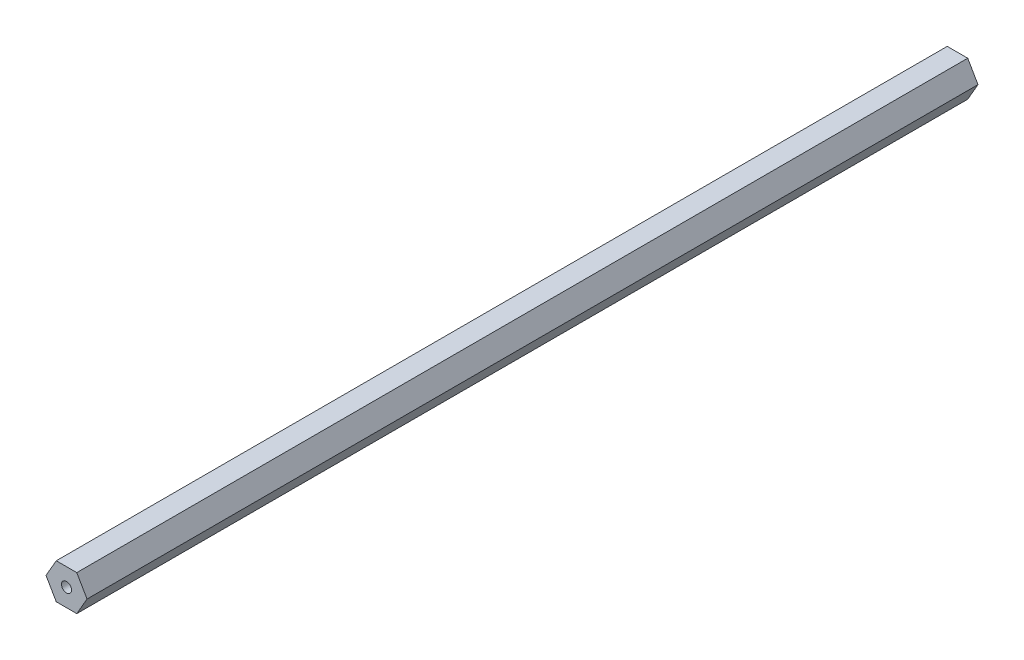
ISO-10303-21;
HEADER;
FILE_DESCRIPTION(('STEP AP214'),'2;1');
FILE_NAME('part.step','',(''),(''),'','','');
FILE_SCHEMA(('AUTOMOTIVE_DESIGN { 1 0 10303 214 1 1 1 1 }'));
ENDSEC;
DATA;
#1=APPLICATION_CONTEXT('core data for automotive mechanical design processes');
#2=APPLICATION_PROTOCOL_DEFINITION('international standard','automotive_design',2000,#1);
#3=PRODUCT_CONTEXT('',#1,'mechanical');
#4=PRODUCT('Part','Part','',(#3));
#5=PRODUCT_RELATED_PRODUCT_CATEGORY('part','',(#4));
#6=PRODUCT_DEFINITION_FORMATION('','',#4);
#7=PRODUCT_DEFINITION_CONTEXT('part definition',#1,'design');
#8=PRODUCT_DEFINITION('design','',#6,#7);
#9=PRODUCT_DEFINITION_SHAPE('','',#8);
#10=(LENGTH_UNIT() NAMED_UNIT(*) SI_UNIT(.MILLI.,.METRE.));
#11=(NAMED_UNIT(*) PLANE_ANGLE_UNIT() SI_UNIT($,.RADIAN.));
#12=(NAMED_UNIT(*) SI_UNIT($,.STERADIAN.) SOLID_ANGLE_UNIT());
#13=UNCERTAINTY_MEASURE_WITH_UNIT(LENGTH_MEASURE(1.E-05),#10,'distance_accuracy_value','');
#14=(GEOMETRIC_REPRESENTATION_CONTEXT(3) GLOBAL_UNCERTAINTY_ASSIGNED_CONTEXT((#13)) GLOBAL_UNIT_ASSIGNED_CONTEXT((#10,
#11,#12)) REPRESENTATION_CONTEXT('',''));
#15=CARTESIAN_POINT('',(0.,0.,0.));
#16=DIRECTION('',(0.,0.,1.));
#17=DIRECTION('',(1.,0.,0.));
#18=AXIS2_PLACEMENT_3D('',#15,#16,#17);
#19=CARTESIAN_POINT('',(2.0495934556232,-3.54999999999996,178.));
#20=DIRECTION('',(-0.866025403784442,0.499999999999995,0.));
#21=DIRECTION('',(-0.499999999999995,-0.866025403784442,0.));
#22=AXIS2_PLACEMENT_3D('',#19,#20,#21);
#23=PLANE('',#22);
#24=DIRECTION('',(0.499999999999995,0.866025403784441,0.));
#25=VECTOR('',#24,1.);
#26=CARTESIAN_POINT('',(2.0495934556232,-3.54999999999996,0.));
#27=LINE('',#26,#25);
#28=CARTESIAN_POINT('',(2.0495934556232,-3.54999999999996,0.));
#29=VERTEX_POINT('',#28);
#30=CARTESIAN_POINT('',(4.09918691124632,0.,0.));
#31=VERTEX_POINT('',#30);
#32=EDGE_CURVE('E134',#29,#31,#27,.T.);
#33=ORIENTED_EDGE('',*,*,#32,.T.);
#34=DIRECTION('',(0.,0.,-1.));
#35=VECTOR('',#34,1.);
#36=CARTESIAN_POINT('',(4.09918691124632,0.,178.));
#37=LINE('',#36,#35);
#38=CARTESIAN_POINT('',(4.09918691124632,0.,178.));
#39=VERTEX_POINT('',#38);
#40=EDGE_CURVE('E11',#39,#31,#37,.T.);
#41=ORIENTED_EDGE('',*,*,#40,.F.);
#42=DIRECTION('',(0.499999999999995,0.866025403784441,0.));
#43=VECTOR('',#42,1.);
#44=CARTESIAN_POINT('',(2.0495934556232,-3.54999999999996,178.));
#45=LINE('',#44,#43);
#46=CARTESIAN_POINT('',(2.0495934556232,-3.54999999999996,178.));
#47=VERTEX_POINT('',#46);
#48=EDGE_CURVE('E151',#47,#39,#45,.T.);
#49=ORIENTED_EDGE('',*,*,#48,.F.);
#50=DIRECTION('',(0.,0.,-1.));
#51=VECTOR('',#50,1.);
#52=CARTESIAN_POINT('',(2.0495934556232,-3.54999999999996,178.));
#53=LINE('',#52,#51);
#54=EDGE_CURVE('E130',#47,#29,#53,.T.);
#55=ORIENTED_EDGE('',*,*,#54,.T.);
#56=EDGE_LOOP('',(#33,#41,#49,#55));
#57=FACE_BOUND('',#56,.T.);
#58=ADVANCED_FACE('F45',(#57),#23,.F.);
#59=CARTESIAN_POINT('',(4.09918691124632,0.,178.));
#60=DIRECTION('',(-0.866025403784438,-0.500000000000001,0.));
#61=DIRECTION('',(0.500000000000001,-0.866025403784438,0.));
#62=AXIS2_PLACEMENT_3D('',#59,#60,#61);
#63=PLANE('',#62);
#64=DIRECTION('',(-0.500000000000001,0.866025403784438,0.));
#65=VECTOR('',#64,1.);
#66=CARTESIAN_POINT('',(4.09918691124632,0.,0.));
#67=LINE('',#66,#65);
#68=CARTESIAN_POINT('',(2.04959345562315,3.54999999999999,0.));
#69=VERTEX_POINT('',#68);
#70=EDGE_CURVE('E138',#31,#69,#67,.T.);
#71=ORIENTED_EDGE('',*,*,#70,.T.);
#72=DIRECTION('',(0.,0.,-1.));
#73=VECTOR('',#72,1.);
#74=CARTESIAN_POINT('',(2.04959345562315,3.54999999999999,178.));
#75=LINE('',#74,#73);
#76=CARTESIAN_POINT('',(2.04959345562315,3.54999999999999,178.));
#77=VERTEX_POINT('',#76);
#78=EDGE_CURVE('E54',#77,#69,#75,.T.);
#79=ORIENTED_EDGE('',*,*,#78,.F.);
#80=DIRECTION('',(-0.500000000000001,0.866025403784438,0.));
#81=VECTOR('',#80,1.);
#82=CARTESIAN_POINT('',(4.09918691124632,0.,178.));
#83=LINE('',#82,#81);
#84=EDGE_CURVE('E99',#39,#77,#83,.T.);
#85=ORIENTED_EDGE('',*,*,#84,.F.);
#86=ORIENTED_EDGE('',*,*,#40,.T.);
#87=EDGE_LOOP('',(#71,#79,#85,#86));
#88=FACE_BOUND('',#87,.T.);
#89=ADVANCED_FACE('F180',(#88),#63,.F.);
#90=CARTESIAN_POINT('',(2.04959345562315,3.54999999999999,178.));
#91=DIRECTION('',(0.,-1.,0.));
#92=DIRECTION('',(1.,0.,0.));
#93=AXIS2_PLACEMENT_3D('',#90,#91,#92);
#94=PLANE('',#93);
#95=DIRECTION('',(-1.,0.,0.));
#96=VECTOR('',#95,1.);
#97=CARTESIAN_POINT('',(2.04959345562315,3.54999999999999,0.));
#98=LINE('',#97,#96);
#99=CARTESIAN_POINT('',(-2.04959345562318,3.54999999999997,0.));
#100=VERTEX_POINT('',#99);
#101=EDGE_CURVE('E142',#69,#100,#98,.T.);
#102=ORIENTED_EDGE('',*,*,#101,.T.);
#103=DIRECTION('',(0.,0.,-1.));
#104=VECTOR('',#103,1.);
#105=CARTESIAN_POINT('',(-2.04959345562318,3.54999999999997,178.));
#106=LINE('',#105,#104);
#107=CARTESIAN_POINT('',(-2.04959345562318,3.54999999999997,178.));
#108=VERTEX_POINT('',#107);
#109=EDGE_CURVE('E123',#108,#100,#106,.T.);
#110=ORIENTED_EDGE('',*,*,#109,.F.);
#111=DIRECTION('',(-1.,0.,0.));
#112=VECTOR('',#111,1.);
#113=CARTESIAN_POINT('',(2.04959345562315,3.54999999999999,178.));
#114=LINE('',#113,#112);
#115=EDGE_CURVE('E112',#77,#108,#114,.T.);
#116=ORIENTED_EDGE('',*,*,#115,.F.);
#117=ORIENTED_EDGE('',*,*,#78,.T.);
#118=EDGE_LOOP('',(#102,#110,#116,#117));
#119=FACE_BOUND('',#118,.T.);
#120=ADVANCED_FACE('F161',(#119),#94,.F.);
#121=CARTESIAN_POINT('',(-2.04959345562318,3.54999999999997,178.));
#122=DIRECTION('',(0.866025403784441,-0.499999999999995,0.));
#123=DIRECTION('',(0.499999999999995,0.866025403784442,0.));
#124=AXIS2_PLACEMENT_3D('',#121,#122,#123);
#125=PLANE('',#124);
#126=DIRECTION('',(-0.499999999999995,-0.866025403784442,0.));
#127=VECTOR('',#126,1.);
#128=CARTESIAN_POINT('',(-2.04959345562318,3.54999999999997,0.));
#129=LINE('',#128,#127);
#130=CARTESIAN_POINT('',(-4.09918691124632,0.,0.));
#131=VERTEX_POINT('',#130);
#132=EDGE_CURVE('E121',#100,#131,#129,.T.);
#133=ORIENTED_EDGE('',*,*,#132,.T.);
#134=DIRECTION('',(0.,0.,-1.));
#135=VECTOR('',#134,1.);
#136=CARTESIAN_POINT('',(-4.09918691124632,0.,178.));
#137=LINE('',#136,#135);
#138=CARTESIAN_POINT('',(-4.09918691124632,0.,178.));
#139=VERTEX_POINT('',#138);
#140=EDGE_CURVE('E118',#139,#131,#137,.T.);
#141=ORIENTED_EDGE('',*,*,#140,.F.);
#142=DIRECTION('',(-0.499999999999995,-0.866025403784442,0.));
#143=VECTOR('',#142,1.);
#144=CARTESIAN_POINT('',(-2.04959345562318,3.54999999999997,178.));
#145=LINE('',#144,#143);
#146=EDGE_CURVE('E106',#108,#139,#145,.T.);
#147=ORIENTED_EDGE('',*,*,#146,.F.);
#148=ORIENTED_EDGE('',*,*,#109,.T.);
#149=EDGE_LOOP('',(#133,#141,#147,#148));
#150=FACE_BOUND('',#149,.T.);
#151=ADVANCED_FACE('F119',(#150),#125,.F.);
#152=CARTESIAN_POINT('',(-4.09918691124632,0.,178.));
#153=DIRECTION('',(0.866025403784435,0.500000000000007,0.));
#154=DIRECTION('',(-0.500000000000007,0.866025403784435,0.));
#155=AXIS2_PLACEMENT_3D('',#152,#153,#154);
#156=PLANE('',#155);
#157=DIRECTION('',(0.500000000000007,-0.866025403784434,0.));
#158=VECTOR('',#157,1.);
#159=CARTESIAN_POINT('',(-4.09918691124632,0.,0.));
#160=LINE('',#159,#158);
#161=CARTESIAN_POINT('',(-2.04959345562313,-3.55,0.));
#162=VERTEX_POINT('',#161);
#163=EDGE_CURVE('E85',#131,#162,#160,.T.);
#164=ORIENTED_EDGE('',*,*,#163,.T.);
#165=DIRECTION('',(0.,0.,-1.));
#166=VECTOR('',#165,1.);
#167=CARTESIAN_POINT('',(-2.04959345562313,-3.55,178.));
#168=LINE('',#167,#166);
#169=CARTESIAN_POINT('',(-2.04959345562313,-3.55,178.));
#170=VERTEX_POINT('',#169);
#171=EDGE_CURVE('E124',#170,#162,#168,.T.);
#172=ORIENTED_EDGE('',*,*,#171,.F.);
#173=DIRECTION('',(0.500000000000007,-0.866025403784434,0.));
#174=VECTOR('',#173,1.);
#175=CARTESIAN_POINT('',(-4.09918691124632,0.,178.));
#176=LINE('',#175,#174);
#177=EDGE_CURVE('E110',#139,#170,#176,.T.);
#178=ORIENTED_EDGE('',*,*,#177,.F.);
#179=ORIENTED_EDGE('',*,*,#140,.T.);
#180=EDGE_LOOP('',(#164,#172,#178,#179));
#181=FACE_BOUND('',#180,.T.);
#182=ADVANCED_FACE('F126',(#181),#156,.F.);
#183=CARTESIAN_POINT('',(-2.04959345562313,-3.55,178.));
#184=DIRECTION('',(0.,1.,0.));
#185=DIRECTION('',(-1.,0.,0.));
#186=AXIS2_PLACEMENT_3D('',#183,#184,#185);
#187=PLANE('',#186);
#188=DIRECTION('',(1.,0.,0.));
#189=VECTOR('',#188,1.);
#190=CARTESIAN_POINT('',(-2.04959345562313,-3.55,0.));
#191=LINE('',#190,#189);
#192=EDGE_CURVE('E91',#162,#29,#191,.T.);
#193=ORIENTED_EDGE('',*,*,#192,.T.);
#194=ORIENTED_EDGE('',*,*,#54,.F.);
#195=DIRECTION('',(1.,0.,0.));
#196=VECTOR('',#195,1.);
#197=CARTESIAN_POINT('',(-2.04959345562313,-3.55,178.));
#198=LINE('',#197,#196);
#199=EDGE_CURVE('E62',#170,#47,#198,.T.);
#200=ORIENTED_EDGE('',*,*,#199,.F.);
#201=ORIENTED_EDGE('',*,*,#171,.T.);
#202=EDGE_LOOP('',(#193,#194,#200,#201));
#203=FACE_BOUND('',#202,.T.);
#204=ADVANCED_FACE('F168',(#203),#187,.F.);
#205=CARTESIAN_POINT('',(0.,0.,178.));
#206=DIRECTION('',(0.,0.,1.));
#207=DIRECTION('',(1.,0.,0.));
#208=AXIS2_PLACEMENT_3D('',#205,#206,#207);
#209=PLANE('',#208);
#210=CARTESIAN_POINT('',(0.,0.,178.));
#211=DIRECTION('',(0.,0.,1.));
#212=DIRECTION('',(1.,0.,0.));
#213=AXIS2_PLACEMENT_3D('',#210,#211,#212);
#214=CIRCLE('',#213,1.);
#215=CARTESIAN_POINT('',(1.,0.,178.));
#216=VERTEX_POINT('',#215);
#217=EDGE_CURVE('E236',#216,#216,#214,.T.);
#218=ORIENTED_EDGE('',*,*,#217,.F.);
#219=EDGE_LOOP('',(#218));
#220=FACE_BOUND('',#219,.T.);
#221=ORIENTED_EDGE('',*,*,#48,.T.);
#222=ORIENTED_EDGE('',*,*,#84,.T.);
#223=ORIENTED_EDGE('',*,*,#115,.T.);
#224=ORIENTED_EDGE('',*,*,#146,.T.);
#225=ORIENTED_EDGE('',*,*,#177,.T.);
#226=ORIENTED_EDGE('',*,*,#199,.T.);
#227=EDGE_LOOP('',(#221,#222,#223,#224,#225,#226));
#228=FACE_BOUND('',#227,.T.);
#229=ADVANCED_FACE('F108',(#220,#228),#209,.T.);
#230=CARTESIAN_POINT('',(0.,0.,0.));
#231=DIRECTION('',(0.,0.,1.));
#232=DIRECTION('',(1.,0.,0.));
#233=AXIS2_PLACEMENT_3D('',#230,#231,#232);
#234=PLANE('',#233);
#235=CARTESIAN_POINT('',(0.,0.,0.));
#236=DIRECTION('',(0.,0.,1.));
#237=DIRECTION('',(1.,0.,0.));
#238=AXIS2_PLACEMENT_3D('',#235,#236,#237);
#239=CIRCLE('',#238,1.);
#240=CARTESIAN_POINT('',(1.,0.,0.));
#241=VERTEX_POINT('',#240);
#242=EDGE_CURVE('E139',#241,#241,#239,.T.);
#243=ORIENTED_EDGE('',*,*,#242,.T.);
#244=EDGE_LOOP('',(#243));
#245=FACE_BOUND('',#244,.T.);
#246=ORIENTED_EDGE('',*,*,#32,.F.);
#247=ORIENTED_EDGE('',*,*,#192,.F.);
#248=ORIENTED_EDGE('',*,*,#163,.F.);
#249=ORIENTED_EDGE('',*,*,#132,.F.);
#250=ORIENTED_EDGE('',*,*,#101,.F.);
#251=ORIENTED_EDGE('',*,*,#70,.F.);
#252=EDGE_LOOP('',(#246,#247,#248,#249,#250,#251));
#253=FACE_BOUND('',#252,.T.);
#254=ADVANCED_FACE('F164',(#245,#253),#234,.F.);
#255=CARTESIAN_POINT('',(0.,0.,0.));
#256=DIRECTION('',(0.,0.,1.));
#257=DIRECTION('',(1.,0.,0.));
#258=AXIS2_PLACEMENT_3D('',#255,#256,#257);
#259=CYLINDRICAL_SURFACE('',#258,1.);
#260=ORIENTED_EDGE('',*,*,#242,.F.);
#261=EDGE_LOOP('',(#260));
#262=FACE_BOUND('',#261,.T.);
#263=ORIENTED_EDGE('',*,*,#217,.T.);
#264=EDGE_LOOP('',(#263));
#265=FACE_BOUND('',#264,.T.);
#266=ADVANCED_FACE('F219',(#262,#265),#259,.F.);
#267=CLOSED_SHELL('',(#58,#89,#120,#151,#182,#204,#229,#254,#266));
#268=MANIFOLD_SOLID_BREP('B2',#267);
#269=ADVANCED_BREP_SHAPE_REPRESENTATION('',(#18,#268),#14);
#270=SHAPE_DEFINITION_REPRESENTATION(#9,#269);
ENDSEC;
END-ISO-10303-21;
